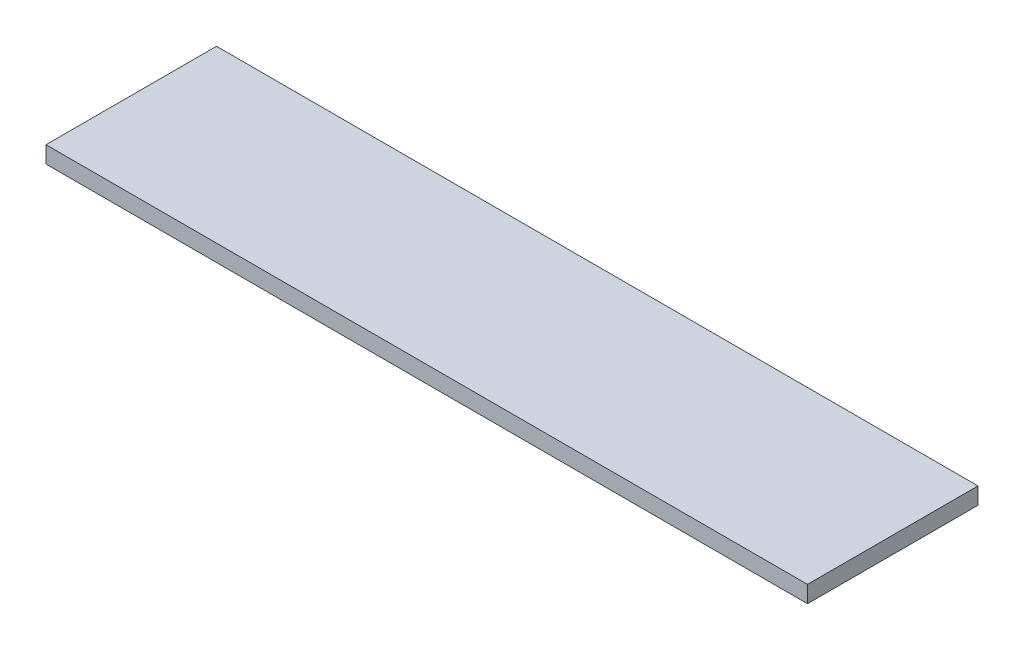
ISO-10303-21;
HEADER;
FILE_DESCRIPTION(('STEP AP214'),'2;1');
FILE_NAME('part.step','',(''),(''),'','','');
FILE_SCHEMA(('AUTOMOTIVE_DESIGN { 1 0 10303 214 1 1 1 1 }'));
ENDSEC;
DATA;
#1=APPLICATION_CONTEXT('core data for automotive mechanical design processes');
#2=APPLICATION_PROTOCOL_DEFINITION('international standard','automotive_design',2000,#1);
#3=PRODUCT_CONTEXT('',#1,'mechanical');
#4=PRODUCT('Part','Part','',(#3));
#5=PRODUCT_RELATED_PRODUCT_CATEGORY('part','',(#4));
#6=PRODUCT_DEFINITION_FORMATION('','',#4);
#7=PRODUCT_DEFINITION_CONTEXT('part definition',#1,'design');
#8=PRODUCT_DEFINITION('design','',#6,#7);
#9=PRODUCT_DEFINITION_SHAPE('','',#8);
#10=(LENGTH_UNIT() NAMED_UNIT(*) SI_UNIT(.MILLI.,.METRE.));
#11=(NAMED_UNIT(*) PLANE_ANGLE_UNIT() SI_UNIT($,.RADIAN.));
#12=(NAMED_UNIT(*) SI_UNIT($,.STERADIAN.) SOLID_ANGLE_UNIT());
#13=UNCERTAINTY_MEASURE_WITH_UNIT(LENGTH_MEASURE(1.E-05),#10,'distance_accuracy_value','');
#14=(GEOMETRIC_REPRESENTATION_CONTEXT(3) GLOBAL_UNCERTAINTY_ASSIGNED_CONTEXT((#13)) GLOBAL_UNIT_ASSIGNED_CONTEXT((#10,
#11,#12)) REPRESENTATION_CONTEXT('',''));
#15=CARTESIAN_POINT('',(0.,0.,0.));
#16=DIRECTION('',(0.,0.,1.));
#17=DIRECTION('',(1.,0.,0.));
#18=AXIS2_PLACEMENT_3D('',#15,#16,#17);
#19=CARTESIAN_POINT('',(45.375,2.,-10.16));
#20=DIRECTION('',(-1.,0.,0.));
#21=DIRECTION('',(0.,0.,1.));
#22=AXIS2_PLACEMENT_3D('',#19,#20,#21);
#23=PLANE('',#22);
#24=DIRECTION('',(0.,0.,-1.));
#25=VECTOR('',#24,1.);
#26=CARTESIAN_POINT('',(45.375,0.,-10.16));
#27=LINE('',#26,#25);
#28=CARTESIAN_POINT('',(45.375,0.,10.16));
#29=VERTEX_POINT('',#28);
#30=CARTESIAN_POINT('',(45.375,0.,-10.16));
#31=VERTEX_POINT('',#30);
#32=EDGE_CURVE('E106',#29,#31,#27,.T.);
#33=ORIENTED_EDGE('',*,*,#32,.T.);
#34=DIRECTION('',(0.,-1.,0.));
#35=VECTOR('',#34,1.);
#36=CARTESIAN_POINT('',(45.375,2.,-10.16));
#37=LINE('',#36,#35);
#38=CARTESIAN_POINT('',(45.375,2.,-10.16));
#39=VERTEX_POINT('',#38);
#40=EDGE_CURVE('E11',#39,#31,#37,.T.);
#41=ORIENTED_EDGE('',*,*,#40,.F.);
#42=DIRECTION('',(0.,0.,-1.));
#43=VECTOR('',#42,1.);
#44=CARTESIAN_POINT('',(45.375,2.,-10.16));
#45=LINE('',#44,#43);
#46=CARTESIAN_POINT('',(45.375,2.,10.16));
#47=VERTEX_POINT('',#46);
#48=EDGE_CURVE('E94',#47,#39,#45,.T.);
#49=ORIENTED_EDGE('',*,*,#48,.F.);
#50=DIRECTION('',(0.,-1.,0.));
#51=VECTOR('',#50,1.);
#52=CARTESIAN_POINT('',(45.375,2.,10.16));
#53=LINE('',#52,#51);
#54=EDGE_CURVE('E102',#47,#29,#53,.T.);
#55=ORIENTED_EDGE('',*,*,#54,.T.);
#56=EDGE_LOOP('',(#33,#41,#49,#55));
#57=FACE_BOUND('',#56,.T.);
#58=ADVANCED_FACE('F43',(#57),#23,.F.);
#59=CARTESIAN_POINT('',(-45.375,2.,-10.16));
#60=DIRECTION('',(0.,0.,1.));
#61=DIRECTION('',(1.,0.,0.));
#62=AXIS2_PLACEMENT_3D('',#59,#60,#61);
#63=PLANE('',#62);
#64=DIRECTION('',(-1.,0.,0.));
#65=VECTOR('',#64,1.);
#66=CARTESIAN_POINT('',(-45.375,0.,-10.16));
#67=LINE('',#66,#65);
#68=CARTESIAN_POINT('',(-45.375,0.,-10.16));
#69=VERTEX_POINT('',#68);
#70=EDGE_CURVE('E98',#31,#69,#67,.T.);
#71=ORIENTED_EDGE('',*,*,#70,.T.);
#72=DIRECTION('',(0.,-1.,0.));
#73=VECTOR('',#72,1.);
#74=CARTESIAN_POINT('',(-45.375,2.,-10.16));
#75=LINE('',#74,#73);
#76=CARTESIAN_POINT('',(-45.375,2.,-10.16));
#77=VERTEX_POINT('',#76);
#78=EDGE_CURVE('E51',#77,#69,#75,.T.);
#79=ORIENTED_EDGE('',*,*,#78,.F.);
#80=DIRECTION('',(-1.,0.,0.));
#81=VECTOR('',#80,1.);
#82=CARTESIAN_POINT('',(-45.375,2.,-10.16));
#83=LINE('',#82,#81);
#84=EDGE_CURVE('E89',#39,#77,#83,.T.);
#85=ORIENTED_EDGE('',*,*,#84,.F.);
#86=ORIENTED_EDGE('',*,*,#40,.T.);
#87=EDGE_LOOP('',(#71,#79,#85,#86));
#88=FACE_BOUND('',#87,.T.);
#89=ADVANCED_FACE('F97',(#88),#63,.F.);
#90=CARTESIAN_POINT('',(-45.375,2.,-10.16));
#91=DIRECTION('',(1.,0.,0.));
#92=DIRECTION('',(0.,0.,-1.));
#93=AXIS2_PLACEMENT_3D('',#90,#91,#92);
#94=PLANE('',#93);
#95=DIRECTION('',(0.,0.,1.));
#96=VECTOR('',#95,1.);
#97=CARTESIAN_POINT('',(-45.375,0.,-10.16));
#98=LINE('',#97,#96);
#99=CARTESIAN_POINT('',(-45.375,0.,10.16));
#100=VERTEX_POINT('',#99);
#101=EDGE_CURVE('E76',#69,#100,#98,.T.);
#102=ORIENTED_EDGE('',*,*,#101,.T.);
#103=DIRECTION('',(0.,-1.,0.));
#104=VECTOR('',#103,1.);
#105=CARTESIAN_POINT('',(-45.375,2.,10.16));
#106=LINE('',#105,#104);
#107=CARTESIAN_POINT('',(-45.375,2.,10.16));
#108=VERTEX_POINT('',#107);
#109=EDGE_CURVE('E99',#108,#100,#106,.T.);
#110=ORIENTED_EDGE('',*,*,#109,.F.);
#111=DIRECTION('',(0.,0.,1.));
#112=VECTOR('',#111,1.);
#113=CARTESIAN_POINT('',(-45.375,2.,-10.16));
#114=LINE('',#113,#112);
#115=EDGE_CURVE('E92',#77,#108,#114,.T.);
#116=ORIENTED_EDGE('',*,*,#115,.F.);
#117=ORIENTED_EDGE('',*,*,#78,.T.);
#118=EDGE_LOOP('',(#102,#110,#116,#117));
#119=FACE_BOUND('',#118,.T.);
#120=ADVANCED_FACE('F100',(#119),#94,.F.);
#121=CARTESIAN_POINT('',(-45.375,2.,10.16));
#122=DIRECTION('',(0.,0.,-1.));
#123=DIRECTION('',(-1.,0.,0.));
#124=AXIS2_PLACEMENT_3D('',#121,#122,#123);
#125=PLANE('',#124);
#126=DIRECTION('',(1.,0.,0.));
#127=VECTOR('',#126,1.);
#128=CARTESIAN_POINT('',(-45.375,0.,10.16));
#129=LINE('',#128,#127);
#130=EDGE_CURVE('E82',#100,#29,#129,.T.);
#131=ORIENTED_EDGE('',*,*,#130,.T.);
#132=ORIENTED_EDGE('',*,*,#54,.F.);
#133=DIRECTION('',(1.,0.,0.));
#134=VECTOR('',#133,1.);
#135=CARTESIAN_POINT('',(-45.375,2.,10.16));
#136=LINE('',#135,#134);
#137=EDGE_CURVE('E59',#108,#47,#136,.T.);
#138=ORIENTED_EDGE('',*,*,#137,.F.);
#139=ORIENTED_EDGE('',*,*,#109,.T.);
#140=EDGE_LOOP('',(#131,#132,#138,#139));
#141=FACE_BOUND('',#140,.T.);
#142=ADVANCED_FACE('F113',(#141),#125,.F.);
#143=CARTESIAN_POINT('',(0.,2.,0.));
#144=DIRECTION('',(0.,1.,0.));
#145=DIRECTION('',(0.,0.,1.));
#146=AXIS2_PLACEMENT_3D('',#143,#144,#145);
#147=PLANE('',#146);
#148=ORIENTED_EDGE('',*,*,#48,.T.);
#149=ORIENTED_EDGE('',*,*,#84,.T.);
#150=ORIENTED_EDGE('',*,*,#115,.T.);
#151=ORIENTED_EDGE('',*,*,#137,.T.);
#152=EDGE_LOOP('',(#148,#149,#150,#151));
#153=FACE_BOUND('',#152,.T.);
#154=ADVANCED_FACE('F90',(#153),#147,.T.);
#155=CARTESIAN_POINT('',(0.,0.,0.));
#156=DIRECTION('',(0.,1.,0.));
#157=DIRECTION('',(0.,0.,1.));
#158=AXIS2_PLACEMENT_3D('',#155,#156,#157);
#159=PLANE('',#158);
#160=ORIENTED_EDGE('',*,*,#32,.F.);
#161=ORIENTED_EDGE('',*,*,#130,.F.);
#162=ORIENTED_EDGE('',*,*,#101,.F.);
#163=ORIENTED_EDGE('',*,*,#70,.F.);
#164=EDGE_LOOP('',(#160,#161,#162,#163));
#165=FACE_BOUND('',#164,.T.);
#166=ADVANCED_FACE('F116',(#165),#159,.F.);
#167=CLOSED_SHELL('',(#58,#89,#120,#142,#154,#166));
#168=MANIFOLD_SOLID_BREP('B2',#167);
#169=ADVANCED_BREP_SHAPE_REPRESENTATION('',(#18,#168),#14);
#170=SHAPE_DEFINITION_REPRESENTATION(#9,#169);
ENDSEC;
END-ISO-10303-21;
